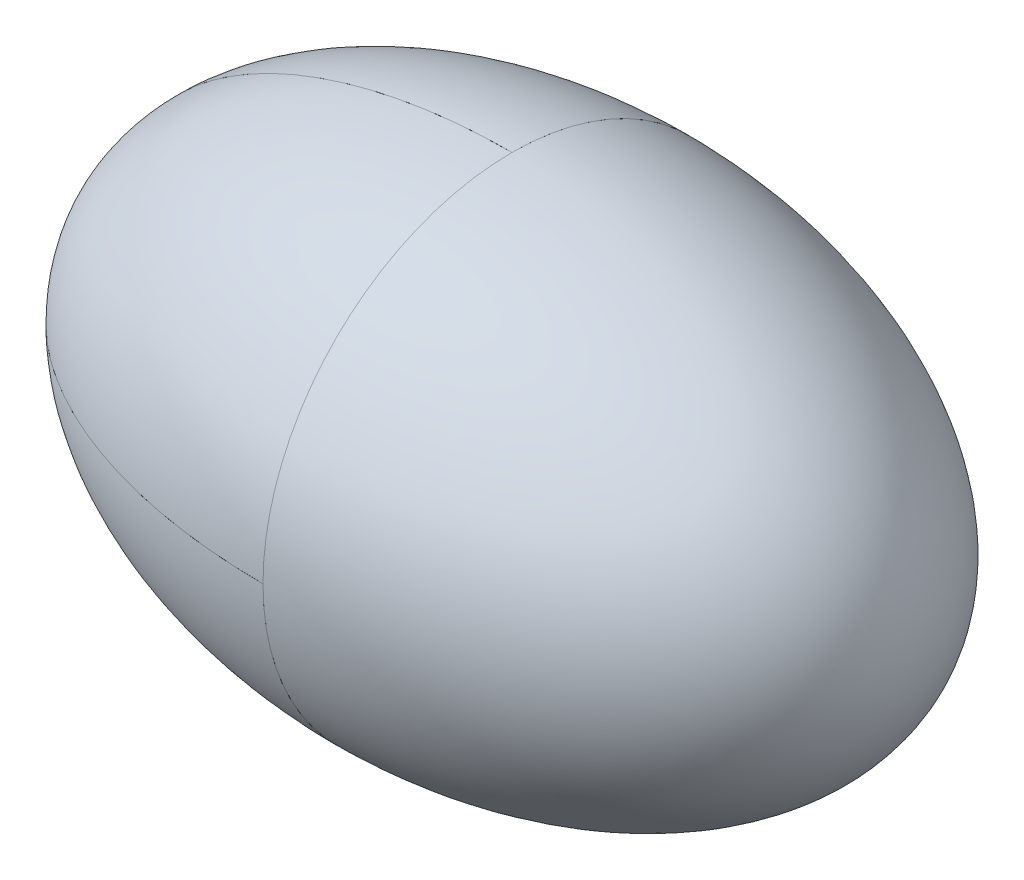
ISO-10303-21;
HEADER;
FILE_DESCRIPTION(('STEP AP214'),'2;1');
FILE_NAME('part.step','',(''),(''),'','','');
FILE_SCHEMA(('AUTOMOTIVE_DESIGN { 1 0 10303 214 1 1 1 1 }'));
ENDSEC;
DATA;
#1=APPLICATION_CONTEXT('core data for automotive mechanical design processes');
#2=APPLICATION_PROTOCOL_DEFINITION('international standard','automotive_design',2000,#1);
#3=PRODUCT_CONTEXT('',#1,'mechanical');
#4=PRODUCT('Part','Part','',(#3));
#5=PRODUCT_RELATED_PRODUCT_CATEGORY('part','',(#4));
#6=PRODUCT_DEFINITION_FORMATION('','',#4);
#7=PRODUCT_DEFINITION_CONTEXT('part definition',#1,'design');
#8=PRODUCT_DEFINITION('design','',#6,#7);
#9=PRODUCT_DEFINITION_SHAPE('','',#8);
#10=(LENGTH_UNIT() NAMED_UNIT(*) SI_UNIT(.MILLI.,.METRE.));
#11=(NAMED_UNIT(*) PLANE_ANGLE_UNIT() SI_UNIT($,.RADIAN.));
#12=(NAMED_UNIT(*) SI_UNIT($,.STERADIAN.) SOLID_ANGLE_UNIT());
#13=UNCERTAINTY_MEASURE_WITH_UNIT(LENGTH_MEASURE(1.E-05),#10,'distance_accuracy_value','');
#14=(GEOMETRIC_REPRESENTATION_CONTEXT(3) GLOBAL_UNCERTAINTY_ASSIGNED_CONTEXT((#13)) GLOBAL_UNIT_ASSIGNED_CONTEXT((#10,
#11,#12)) REPRESENTATION_CONTEXT('',''));
#15=CARTESIAN_POINT('',(0.,0.,0.));
#16=DIRECTION('',(0.,0.,1.));
#17=DIRECTION('',(1.,0.,0.));
#18=AXIS2_PLACEMENT_3D('',#15,#16,#17);
#19=CARTESIAN_POINT('',(0.,0.,0.));
#20=DIRECTION('',(0.,0.,1.));
#21=DIRECTION('',(-1.,0.,0.));
#22=AXIS2_PLACEMENT_3D('',#19,#20,#21);
#23=ELLIPSE('',#22,134.62,85.09);
#24=TRIMMED_CURVE('',#23,(PARAMETER_VALUE(3.14159265358979)),
(PARAMETER_VALUE(6.28318530717959)),.T.,.PARAMETER.);
#25=CARTESIAN_POINT('',(0.,0.,0.));
#26=DIRECTION('',(-1.,0.,0.));
#27=AXIS1_PLACEMENT('',#25,#26);
#28=SURFACE_OF_REVOLUTION('',#24,#27);
#29=CARTESIAN_POINT('',(0.,0.,0.));
#30=DIRECTION('',(-1.,0.,0.));
#31=DIRECTION('',(0.,0.,1.));
#32=AXIS2_PLACEMENT_3D('',#29,#30,#31);
#33=CIRCLE('',#32,85.09);
#34=CARTESIAN_POINT('',(0.,0.,85.09));
#35=VERTEX_POINT('',#34);
#36=EDGE_CURVE('E12',#35,#35,#33,.T.);
#37=ORIENTED_EDGE('',*,*,#36,.F.);
#38=EDGE_LOOP('',(#37));
#39=FACE_BOUND('',#38,.T.);
#40=CARTESIAN_POINT('',(134.62,0.,0.));
#41=VERTEX_POINT('',#40);
#42=VERTEX_LOOP('',#41);
#43=FACE_BOUND('',#42,.T.);
#44=ADVANCED_FACE('F56',(#39,#43),#28,.T.);
#45=CARTESIAN_POINT('',(0.,0.,0.));
#46=DIRECTION('',(1.,0.,0.));
#47=DIRECTION('',(0.,0.,-1.));
#48=AXIS2_PLACEMENT_3D('',#45,#46,#47);
#49=PLANE('',#48);
#50=ORIENTED_EDGE('',*,*,#36,.T.);
#51=EDGE_LOOP('',(#50));
#52=FACE_BOUND('',#51,.T.);
#53=ADVANCED_FACE('F66',(#52),#49,.F.);
#54=CLOSED_SHELL('',(#44,#53));
#55=MANIFOLD_SOLID_BREP('B2',#54);
#56=CARTESIAN_POINT('',(2.35011608917531E-13,0.,0.));
#57=DIRECTION('',(-1.,0.,0.));
#58=DIRECTION('',(0.,-1.,0.));
#59=AXIS2_PLACEMENT_3D('',#56,#57,#58);
#60=PLANE('',#59);
#61=DIRECTION('',(0.,1.,0.));
#62=VECTOR('',#61,1.);
#63=CARTESIAN_POINT('',(0.,0.,0.));
#64=LINE('',#63,#62);
#65=CARTESIAN_POINT('',(7.36007852922129E-13,-85.09,0.));
#66=VERTEX_POINT('',#65);
#67=CARTESIAN_POINT('',(0.,0.,0.));
#68=VERTEX_POINT('',#67);
#69=EDGE_CURVE('E128',#66,#68,#64,.T.);
#70=ORIENTED_EDGE('',*,*,#69,.T.);
#71=DIRECTION('',(0.,0.,-1.));
#72=VECTOR('',#71,1.);
#73=CARTESIAN_POINT('',(0.,0.,0.));
#74=LINE('',#73,#72);
#75=CARTESIAN_POINT('',(4.70023217835062E-13,2.97090147122164E-13,85.09));
#76=VERTEX_POINT('',#75);
#77=EDGE_CURVE('E130',#76,#68,#74,.T.);
#78=ORIENTED_EDGE('',*,*,#77,.F.);
#79=CARTESIAN_POINT('',(4.71844785465692E-13,0.,0.));
#80=DIRECTION('',(1.,0.,0.));
#81=DIRECTION('',(0.,1.,0.));
#82=AXIS2_PLACEMENT_3D('',#79,#80,#81);
#83=CIRCLE('',#82,85.09);
#84=EDGE_CURVE('E54',#76,#66,#83,.T.);
#85=ORIENTED_EDGE('',*,*,#84,.T.);
#86=EDGE_LOOP('',(#70,#78,#85));
#87=FACE_BOUND('',#86,.T.);
#88=ADVANCED_FACE('F101',(#87),#60,.F.);
#89=CARTESIAN_POINT('',(0.,0.,0.));
#90=DIRECTION('',(0.,1.,0.));
#91=DIRECTION('',(-1.,0.,0.));
#92=AXIS2_PLACEMENT_3D('',#89,#90,#91);
#93=ELLIPSE('',#92,134.62,85.09);
#94=TRIMMED_CURVE('',#93,(PARAMETER_VALUE(0.)),(PARAMETER_VALUE(3.14159265358979)),.T.,.PARAMETER.);
#95=CARTESIAN_POINT('',(-134.62,-4.20811512227299E-13,0.));
#96=DIRECTION('',(1.,0.,0.));
#97=AXIS1_PLACEMENT('',#95,#96);
#98=SURFACE_OF_REVOLUTION('',#94,#97);
#99=CARTESIAN_POINT('',(-134.62,-4.20811512227299E-13,0.));
#100=VERTEX_POINT('',#99);
#101=EDGE_CURVE('E109',#100,#76,#93,.T.);
#102=ORIENTED_EDGE('',*,*,#101,.F.);
#103=CARTESIAN_POINT('',(0.,0.,0.));
#104=DIRECTION('',(0.,0.,1.));
#105=DIRECTION('',(-1.,0.,0.));
#106=AXIS2_PLACEMENT_3D('',#103,#104,#105);
#107=ELLIPSE('',#106,134.62,85.09);
#108=EDGE_CURVE('E121',#100,#66,#107,.T.);
#109=ORIENTED_EDGE('',*,*,#108,.T.);
#110=ORIENTED_EDGE('',*,*,#84,.F.);
#111=EDGE_LOOP('',(#102,#109,#110));
#112=FACE_BOUND('',#111,.T.);
#113=ADVANCED_FACE('F103',(#112),#98,.T.);
#114=CARTESIAN_POINT('',(0.,0.,0.));
#115=DIRECTION('',(0.,1.,0.));
#116=DIRECTION('',(1.,0.,0.));
#117=AXIS2_PLACEMENT_3D('',#114,#115,#116);
#118=PLANE('',#117);
#119=ORIENTED_EDGE('',*,*,#77,.T.);
#120=DIRECTION('',(-1.,0.,0.));
#121=VECTOR('',#120,1.);
#122=CARTESIAN_POINT('',(-134.62,-4.20811512227299E-13,0.));
#123=LINE('',#122,#121);
#124=EDGE_CURVE('E133',#68,#100,#123,.T.);
#125=ORIENTED_EDGE('',*,*,#124,.T.);
#126=ORIENTED_EDGE('',*,*,#101,.T.);
#127=EDGE_LOOP('',(#119,#125,#126));
#128=FACE_BOUND('',#127,.T.);
#129=ADVANCED_FACE('F140',(#128),#118,.T.);
#130=CARTESIAN_POINT('',(0.,0.,0.));
#131=DIRECTION('',(0.,0.,1.));
#132=DIRECTION('',(1.,0.,0.));
#133=AXIS2_PLACEMENT_3D('',#130,#131,#132);
#134=PLANE('',#133);
#135=ORIENTED_EDGE('',*,*,#69,.F.);
#136=ORIENTED_EDGE('',*,*,#108,.F.);
#137=ORIENTED_EDGE('',*,*,#124,.F.);
#138=EDGE_LOOP('',(#135,#136,#137));
#139=FACE_BOUND('',#138,.T.);
#140=ADVANCED_FACE('F132',(#139),#134,.F.);
#141=CLOSED_SHELL('',(#88,#113,#129,#140));
#142=MANIFOLD_SOLID_BREP('B6',#141);
#143=CARTESIAN_POINT('',(6.98332102000151E-13,-2.97090147122162E-13,-85.09));
#144=DIRECTION('',(-1.,0.,0.));
#145=DIRECTION('',(0.,0.,1.));
#146=AXIS2_PLACEMENT_3D('',#143,#144,#145);
#147=PLANE('',#146);
#148=DIRECTION('',(0.,-1.,0.));
#149=VECTOR('',#148,1.);
#150=CARTESIAN_POINT('',(1.41006965350519E-12,85.09,0.));
#151=LINE('',#150,#149);
#152=CARTESIAN_POINT('',(1.3966642040003E-12,85.09,0.));
#153=VERTEX_POINT('',#152);
#154=CARTESIAN_POINT('',(0.,0.,0.));
#155=VERTEX_POINT('',#154);
#156=EDGE_CURVE('E219',#153,#155,#151,.T.);
#157=ORIENTED_EDGE('',*,*,#156,.T.);
#158=DIRECTION('',(0.,0.,1.));
#159=VECTOR('',#158,1.);
#160=CARTESIAN_POINT('',(1.41006965350519E-12,-2.97090147122162E-13,-85.09));
#161=LINE('',#160,#159);
#162=CARTESIAN_POINT('',(1.3966642040003E-12,-2.97090147122162E-13,-85.09));
#163=VERTEX_POINT('',#162);
#164=EDGE_CURVE('E221',#163,#155,#161,.T.);
#165=ORIENTED_EDGE('',*,*,#164,.F.);
#166=CARTESIAN_POINT('',(1.3966642040003E-12,0.,0.));
#167=DIRECTION('',(1.,0.,0.));
#168=DIRECTION('',(0.,0.,-1.));
#169=AXIS2_PLACEMENT_3D('',#166,#167,#168);
#170=CIRCLE('',#169,85.09);
#171=EDGE_CURVE('E99',#163,#153,#170,.T.);
#172=ORIENTED_EDGE('',*,*,#171,.T.);
#173=EDGE_LOOP('',(#157,#165,#172));
#174=FACE_BOUND('',#173,.T.);
#175=ADVANCED_FACE('F192',(#174),#147,.F.);
#176=CARTESIAN_POINT('',(0.,0.,0.));
#177=DIRECTION('',(0.,-1.,0.));
#178=DIRECTION('',(-1.,0.,0.));
#179=AXIS2_PLACEMENT_3D('',#176,#177,#178);
#180=ELLIPSE('',#179,134.62,85.09);
#181=TRIMMED_CURVE('',#180,(PARAMETER_VALUE(0.)),(PARAMETER_VALUE(3.14159265358979)),.T.,.PARAMETER.);
#182=CARTESIAN_POINT('',(0.,0.,0.));
#183=DIRECTION('',(1.,0.,0.));
#184=AXIS1_PLACEMENT('',#182,#183);
#185=SURFACE_OF_REVOLUTION('',#181,#184);
#186=CARTESIAN_POINT('',(-134.62,0.,0.));
#187=VERTEX_POINT('',#186);
#188=EDGE_CURVE('E200',#187,#163,#180,.T.);
#189=ORIENTED_EDGE('',*,*,#188,.F.);
#190=CARTESIAN_POINT('',(0.,0.,0.));
#191=DIRECTION('',(0.,0.,-1.));
#192=DIRECTION('',(-1.,0.,0.));
#193=AXIS2_PLACEMENT_3D('',#190,#191,#192);
#194=ELLIPSE('',#193,134.62,85.09);
#195=EDGE_CURVE('E212',#187,#153,#194,.T.);
#196=ORIENTED_EDGE('',*,*,#195,.T.);
#197=ORIENTED_EDGE('',*,*,#171,.F.);
#198=EDGE_LOOP('',(#189,#196,#197));
#199=FACE_BOUND('',#198,.T.);
#200=ADVANCED_FACE('F194',(#199),#185,.T.);
#201=CARTESIAN_POINT('',(0.,0.,0.));
#202=DIRECTION('',(0.,-1.,0.));
#203=DIRECTION('',(-1.,0.,0.));
#204=AXIS2_PLACEMENT_3D('',#201,#202,#203);
#205=PLANE('',#204);
#206=ORIENTED_EDGE('',*,*,#164,.T.);
#207=DIRECTION('',(-1.,0.,0.));
#208=VECTOR('',#207,1.);
#209=CARTESIAN_POINT('',(0.,0.,0.));
#210=LINE('',#209,#208);
#211=EDGE_CURVE('E224',#155,#187,#210,.T.);
#212=ORIENTED_EDGE('',*,*,#211,.T.);
#213=ORIENTED_EDGE('',*,*,#188,.T.);
#214=EDGE_LOOP('',(#206,#212,#213));
#215=FACE_BOUND('',#214,.T.);
#216=ADVANCED_FACE('F231',(#215),#205,.T.);
#217=CARTESIAN_POINT('',(0.,0.,0.));
#218=DIRECTION('',(0.,0.,-1.));
#219=DIRECTION('',(-1.,0.,0.));
#220=AXIS2_PLACEMENT_3D('',#217,#218,#219);
#221=PLANE('',#220);
#222=ORIENTED_EDGE('',*,*,#156,.F.);
#223=ORIENTED_EDGE('',*,*,#195,.F.);
#224=ORIENTED_EDGE('',*,*,#211,.F.);
#225=EDGE_LOOP('',(#222,#223,#224));
#226=FACE_BOUND('',#225,.T.);
#227=ADVANCED_FACE('F223',(#226),#221,.F.);
#228=CLOSED_SHELL('',(#175,#200,#216,#227));
#229=MANIFOLD_SOLID_BREP('B48',#228);
#230=CARTESIAN_POINT('',(1.11022302462516E-13,0.,0.));
#231=DIRECTION('',(0.,-1.,0.));
#232=DIRECTION('',(1.,0.,0.));
#233=AXIS2_PLACEMENT_3D('',#230,#231,#232);
#234=ELLIPSE('',#233,134.62,85.09);
#235=TRIMMED_CURVE('',#234,(PARAMETER_VALUE(3.14159265358979)),
(PARAMETER_VALUE(6.28318530717959)),.T.,.PARAMETER.);
#236=CARTESIAN_POINT('',(-134.62,0.,0.));
#237=DIRECTION('',(-1.,0.,0.));
#238=AXIS1_PLACEMENT('',#236,#237);
#239=SURFACE_OF_REVOLUTION('',#235,#238);
#240=CARTESIAN_POINT('',(0.,0.,0.));
#241=DIRECTION('',(-1.,0.,0.));
#242=DIRECTION('',(0.,-1.,0.));
#243=AXIS2_PLACEMENT_3D('',#240,#241,#242);
#244=CIRCLE('',#243,85.09);
#245=CARTESIAN_POINT('',(0.,3.38723510545606E-13,-85.09));
#246=VERTEX_POINT('',#245);
#247=CARTESIAN_POINT('',(0.,-85.09,0.));
#248=VERTEX_POINT('',#247);
#249=EDGE_CURVE('E190',#246,#248,#244,.T.);
#250=ORIENTED_EDGE('',*,*,#249,.T.);
#251=CARTESIAN_POINT('',(1.11022302462516E-13,0.,0.));
#252=DIRECTION('',(0.,0.,1.));
#253=DIRECTION('',(1.,0.,0.));
#254=AXIS2_PLACEMENT_3D('',#251,#252,#253);
#255=ELLIPSE('',#254,134.62,85.09);
#256=CARTESIAN_POINT('',(-134.62,0.,0.));
#257=VERTEX_POINT('',#256);
#258=EDGE_CURVE('E296',#257,#248,#255,.T.);
#259=ORIENTED_EDGE('',*,*,#258,.F.);
#260=EDGE_CURVE('E308',#257,#246,#234,.T.);
#261=ORIENTED_EDGE('',*,*,#260,.T.);
#262=EDGE_LOOP('',(#250,#259,#261));
#263=FACE_BOUND('',#262,.T.);
#264=ADVANCED_FACE('F282',(#263),#239,.F.);
#265=CARTESIAN_POINT('',(0.,0.,0.));
#266=DIRECTION('',(-1.,0.,0.));
#267=DIRECTION('',(0.,-1.,0.));
#268=AXIS2_PLACEMENT_3D('',#265,#266,#267);
#269=PLANE('',#268);
#270=DIRECTION('',(0.,-1.,0.));
#271=VECTOR('',#270,1.);
#272=CARTESIAN_POINT('',(1.11022302462516E-13,0.,0.));
#273=LINE('',#272,#271);
#274=CARTESIAN_POINT('',(1.11022302462516E-13,0.,0.));
#275=VERTEX_POINT('',#274);
#276=EDGE_CURVE('E314',#275,#248,#273,.T.);
#277=ORIENTED_EDGE('',*,*,#276,.T.);
#278=ORIENTED_EDGE('',*,*,#249,.F.);
#279=DIRECTION('',(0.,0.,-1.));
#280=VECTOR('',#279,1.);
#281=CARTESIAN_POINT('',(1.11022302462516E-13,0.,0.));
#282=LINE('',#281,#280);
#283=EDGE_CURVE('E316',#275,#246,#282,.T.);
#284=ORIENTED_EDGE('',*,*,#283,.F.);
#285=EDGE_LOOP('',(#277,#278,#284));
#286=FACE_BOUND('',#285,.T.);
#287=ADVANCED_FACE('F284',(#286),#269,.F.);
#288=CARTESIAN_POINT('',(1.11022302462516E-13,0.,0.));
#289=DIRECTION('',(0.,-1.,0.));
#290=DIRECTION('',(1.,0.,0.));
#291=AXIS2_PLACEMENT_3D('',#288,#289,#290);
#292=PLANE('',#291);
#293=ORIENTED_EDGE('',*,*,#260,.F.);
#294=DIRECTION('',(1.,0.,0.));
#295=VECTOR('',#294,1.);
#296=CARTESIAN_POINT('',(-134.62,0.,0.));
#297=LINE('',#296,#295);
#298=EDGE_CURVE('E290',#257,#275,#297,.T.);
#299=ORIENTED_EDGE('',*,*,#298,.T.);
#300=ORIENTED_EDGE('',*,*,#283,.T.);
#301=EDGE_LOOP('',(#293,#299,#300));
#302=FACE_BOUND('',#301,.T.);
#303=ADVANCED_FACE('F323',(#302),#292,.F.);
#304=CARTESIAN_POINT('',(1.11022302462516E-13,0.,0.));
#305=DIRECTION('',(0.,0.,1.));
#306=DIRECTION('',(1.,0.,0.));
#307=AXIS2_PLACEMENT_3D('',#304,#305,#306);
#308=PLANE('',#307);
#309=ORIENTED_EDGE('',*,*,#258,.T.);
#310=ORIENTED_EDGE('',*,*,#276,.F.);
#311=ORIENTED_EDGE('',*,*,#298,.F.);
#312=EDGE_LOOP('',(#309,#310,#311));
#313=FACE_BOUND('',#312,.T.);
#314=ADVANCED_FACE('F313',(#313),#308,.T.);
#315=CLOSED_SHELL('',(#264,#287,#303,#314));
#316=MANIFOLD_SOLID_BREP('B93',#315);
#317=CARTESIAN_POINT('',(0.,-2.97090147122162E-13,85.09));
#318=DIRECTION('',(-1.,0.,0.));
#319=DIRECTION('',(0.,-1.,0.));
#320=AXIS2_PLACEMENT_3D('',#317,#318,#319);
#321=PLANE('',#320);
#322=CARTESIAN_POINT('',(0.,0.,0.));
#323=DIRECTION('',(-1.,0.,0.));
#324=DIRECTION('',(0.,-1.,0.));
#325=AXIS2_PLACEMENT_3D('',#322,#323,#324);
#326=CIRCLE('',#325,85.09);
#327=CARTESIAN_POINT('',(0.,-2.97090147122162E-13,85.09));
#328=VERTEX_POINT('',#327);
#329=CARTESIAN_POINT('',(0.,85.09,0.));
#330=VERTEX_POINT('',#329);
#331=EDGE_CURVE('E280',#328,#330,#326,.T.);
#332=ORIENTED_EDGE('',*,*,#331,.F.);
#333=DIRECTION('',(0.,0.,1.));
#334=VECTOR('',#333,1.);
#335=CARTESIAN_POINT('',(0.,-2.97090147122162E-13,85.09));
#336=LINE('',#335,#334);
#337=CARTESIAN_POINT('',(0.,0.,0.));
#338=VERTEX_POINT('',#337);
#339=EDGE_CURVE('E395',#338,#328,#336,.T.);
#340=ORIENTED_EDGE('',*,*,#339,.F.);
#341=DIRECTION('',(0.,1.,0.));
#342=VECTOR('',#341,1.);
#343=CARTESIAN_POINT('',(0.,85.09,0.));
#344=LINE('',#343,#342);
#345=EDGE_CURVE('E379',#338,#330,#344,.T.);
#346=ORIENTED_EDGE('',*,*,#345,.T.);
#347=EDGE_LOOP('',(#332,#340,#346));
#348=FACE_BOUND('',#347,.T.);
#349=ADVANCED_FACE('F363',(#348),#321,.F.);
#350=CARTESIAN_POINT('',(0.,0.,0.));
#351=DIRECTION('',(0.,-1.,0.));
#352=DIRECTION('',(1.,0.,0.));
#353=AXIS2_PLACEMENT_3D('',#350,#351,#352);
#354=ELLIPSE('',#353,134.62,85.09);
#355=TRIMMED_CURVE('',#354,(PARAMETER_VALUE(0.)),(PARAMETER_VALUE(3.14159265358979)),.T.,.PARAMETER.);
#356=CARTESIAN_POINT('',(-134.62,0.,0.));
#357=DIRECTION('',(-1.,0.,0.));
#358=AXIS1_PLACEMENT('',#356,#357);
#359=SURFACE_OF_REVOLUTION('',#355,#358);
#360=CARTESIAN_POINT('',(0.,0.,0.));
#361=DIRECTION('',(0.,0.,1.));
#362=DIRECTION('',(1.,0.,0.));
#363=AXIS2_PLACEMENT_3D('',#360,#361,#362);
#364=ELLIPSE('',#363,134.62,85.09);
#365=CARTESIAN_POINT('',(-134.62,0.,0.));
#366=VERTEX_POINT('',#365);
#367=EDGE_CURVE('E390',#330,#366,#364,.T.);
#368=ORIENTED_EDGE('',*,*,#367,.T.);
#369=EDGE_CURVE('E392',#328,#366,#354,.T.);
#370=ORIENTED_EDGE('',*,*,#369,.F.);
#371=ORIENTED_EDGE('',*,*,#331,.T.);
#372=EDGE_LOOP('',(#368,#370,#371));
#373=FACE_BOUND('',#372,.T.);
#374=ADVANCED_FACE('F365',(#373),#359,.T.);
#375=CARTESIAN_POINT('',(0.,0.,0.));
#376=DIRECTION('',(0.,-1.,0.));
#377=DIRECTION('',(1.,0.,0.));
#378=AXIS2_PLACEMENT_3D('',#375,#376,#377);
#379=PLANE('',#378);
#380=ORIENTED_EDGE('',*,*,#339,.T.);
#381=ORIENTED_EDGE('',*,*,#369,.T.);
#382=DIRECTION('',(1.,0.,0.));
#383=VECTOR('',#382,1.);
#384=CARTESIAN_POINT('',(-134.62,0.,0.));
#385=LINE('',#384,#383);
#386=EDGE_CURVE('E372',#366,#338,#385,.T.);
#387=ORIENTED_EDGE('',*,*,#386,.T.);
#388=EDGE_LOOP('',(#380,#381,#387));
#389=FACE_BOUND('',#388,.T.);
#390=ADVANCED_FACE('F402',(#389),#379,.T.);
#391=CARTESIAN_POINT('',(0.,0.,0.));
#392=DIRECTION('',(0.,0.,1.));
#393=DIRECTION('',(1.,0.,0.));
#394=AXIS2_PLACEMENT_3D('',#391,#392,#393);
#395=PLANE('',#394);
#396=ORIENTED_EDGE('',*,*,#345,.F.);
#397=ORIENTED_EDGE('',*,*,#386,.F.);
#398=ORIENTED_EDGE('',*,*,#367,.F.);
#399=EDGE_LOOP('',(#396,#397,#398));
#400=FACE_BOUND('',#399,.T.);
#401=ADVANCED_FACE('F397',(#400),#395,.F.);
#402=CLOSED_SHELL('',(#349,#374,#390,#401));
#403=MANIFOLD_SOLID_BREP('B184',#402);
#404=ADVANCED_BREP_SHAPE_REPRESENTATION('',(#18,#55,#142,#229,#316,#403),#14);
#405=SHAPE_DEFINITION_REPRESENTATION(#9,#404);
ENDSEC;
END-ISO-10303-21;
